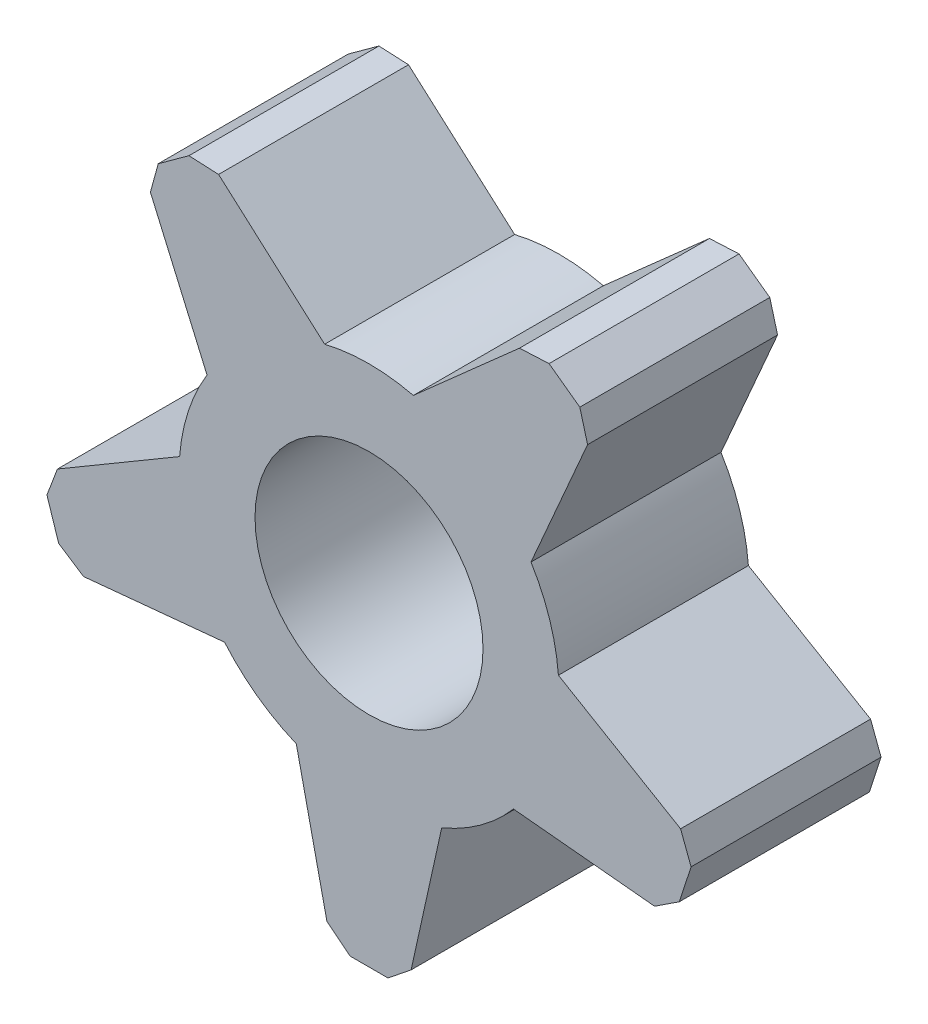
ISO-10303-21;
HEADER;
FILE_DESCRIPTION(('STEP AP214'),'2;1');
FILE_NAME('part.step','',(''),(''),'','','');
FILE_SCHEMA(('AUTOMOTIVE_DESIGN { 1 0 10303 214 1 1 1 1 }'));
ENDSEC;
DATA;
#1=APPLICATION_CONTEXT('core data for automotive mechanical design processes');
#2=APPLICATION_PROTOCOL_DEFINITION('international standard','automotive_design',2000,#1);
#3=PRODUCT_CONTEXT('',#1,'mechanical');
#4=PRODUCT('Part','Part','',(#3));
#5=PRODUCT_RELATED_PRODUCT_CATEGORY('part','',(#4));
#6=PRODUCT_DEFINITION_FORMATION('','',#4);
#7=PRODUCT_DEFINITION_CONTEXT('part definition',#1,'design');
#8=PRODUCT_DEFINITION('design','',#6,#7);
#9=PRODUCT_DEFINITION_SHAPE('','',#8);
#10=(LENGTH_UNIT() NAMED_UNIT(*) SI_UNIT(.MILLI.,.METRE.));
#11=(NAMED_UNIT(*) PLANE_ANGLE_UNIT() SI_UNIT($,.RADIAN.));
#12=(NAMED_UNIT(*) SI_UNIT($,.STERADIAN.) SOLID_ANGLE_UNIT());
#13=UNCERTAINTY_MEASURE_WITH_UNIT(LENGTH_MEASURE(1.E-05),#10,'distance_accuracy_value','');
#14=(GEOMETRIC_REPRESENTATION_CONTEXT(3) GLOBAL_UNCERTAINTY_ASSIGNED_CONTEXT((#13)) GLOBAL_UNIT_ASSIGNED_CONTEXT((#10,
#11,#12)) REPRESENTATION_CONTEXT('',''));
#15=CARTESIAN_POINT('',(0.,0.,0.));
#16=DIRECTION('',(0.,0.,1.));
#17=DIRECTION('',(1.,0.,0.));
#18=AXIS2_PLACEMENT_3D('',#15,#16,#17);
#19=CARTESIAN_POINT('',(0.,0.,-5.));
#20=DIRECTION('',(0.,0.,1.));
#21=DIRECTION('',(1.,0.,0.));
#22=AXIS2_PLACEMENT_3D('',#19,#20,#21);
#23=CYLINDRICAL_SURFACE('',#22,10.);
#24=DIRECTION('',(0.,0.,1.));
#25=VECTOR('',#24,1.);
#26=CARTESIAN_POINT('',(8.52640164354097,5.22498564715941,-5.));
#27=LINE('',#26,#25);
#28=CARTESIAN_POINT('',(8.52640164354097,5.22498564715941,-5.));
#29=VERTEX_POINT('',#28);
#30=CARTESIAN_POINT('',(8.52640164354097,5.22498564715941,5.));
#31=VERTEX_POINT('',#30);
#32=EDGE_CURVE('E39',#29,#31,#27,.T.);
#33=ORIENTED_EDGE('',*,*,#32,.T.);
#34=CARTESIAN_POINT('',(0.,0.,5.));
#35=DIRECTION('',(0.,0.,1.));
#36=DIRECTION('',(1.,0.,0.));
#37=AXIS2_PLACEMENT_3D('',#34,#35,#36);
#38=CIRCLE('',#37,10.);
#39=CARTESIAN_POINT('',(9.96917333733129,0.784590957278344,5.));
#40=VERTEX_POINT('',#39);
#41=EDGE_CURVE('E233',#40,#31,#38,.T.);
#42=ORIENTED_EDGE('',*,*,#41,.F.);
#43=DIRECTION('',(0.,0.,1.));
#44=VECTOR('',#43,1.);
#45=CARTESIAN_POINT('',(9.96917333733129,0.784590957278344,-5.));
#46=LINE('',#45,#44);
#47=CARTESIAN_POINT('',(9.96917333733129,0.784590957278344,-5.));
#48=VERTEX_POINT('',#47);
#49=EDGE_CURVE('E11',#48,#40,#46,.T.);
#50=ORIENTED_EDGE('',*,*,#49,.F.);
#51=CARTESIAN_POINT('',(0.,0.,-5.));
#52=DIRECTION('',(0.,0.,1.));
#53=DIRECTION('',(1.,0.,0.));
#54=AXIS2_PLACEMENT_3D('',#51,#52,#53);
#55=CIRCLE('',#54,10.);
#56=EDGE_CURVE('E236',#48,#29,#55,.T.);
#57=ORIENTED_EDGE('',*,*,#56,.T.);
#58=EDGE_LOOP('',(#33,#42,#50,#57));
#59=FACE_BOUND('',#58,.T.);
#60=ADVANCED_FACE('F35',(#59),#23,.T.);
#61=CARTESIAN_POINT('',(2.90625939543597,4.93988338272082,-5.));
#62=DIRECTION('',(-0.507077891595556,-0.861900233121564,0.));
#63=DIRECTION('',(0.861900233121564,-0.507077891595556,0.));
#64=AXIS2_PLACEMENT_3D('',#61,#62,#63);
#65=PLANE('',#64);
#66=ORIENTED_EDGE('',*,*,#49,.T.);
#67=DIRECTION('',(0.861900233121564,-0.507077891595556,0.));
#68=VECTOR('',#67,1.);
#69=CARTESIAN_POINT('',(2.90625939543597,4.93988338272082,5.));
#70=LINE('',#69,#68);
#71=CARTESIAN_POINT('',(16.3996227907935,-2.99860647737591,5.));
#72=VERTEX_POINT('',#71);
#73=EDGE_CURVE('E253',#40,#72,#70,.T.);
#74=ORIENTED_EDGE('',*,*,#73,.T.);
#75=DIRECTION('',(0.,0.,1.));
#76=VECTOR('',#75,1.);
#77=CARTESIAN_POINT('',(16.3996227907935,-2.99860647737591,-5.));
#78=LINE('',#77,#76);
#79=CARTESIAN_POINT('',(16.3996227907935,-2.99860647737591,-5.));
#80=VERTEX_POINT('',#79);
#81=EDGE_CURVE('E44',#80,#72,#78,.T.);
#82=ORIENTED_EDGE('',*,*,#81,.F.);
#83=DIRECTION('',(0.861900233121564,-0.507077891595556,0.));
#84=VECTOR('',#83,1.);
#85=CARTESIAN_POINT('',(2.90625939543597,4.93988338272082,-5.));
#86=LINE('',#85,#84);
#87=EDGE_CURVE('E241',#48,#80,#86,.T.);
#88=ORIENTED_EDGE('',*,*,#87,.F.);
#89=EDGE_LOOP('',(#66,#74,#82,#88));
#90=FACE_BOUND('',#89,.T.);
#91=ADVANCED_FACE('F522',(#90),#65,.F.);
#92=CARTESIAN_POINT('',(13.3441346827919,5.0597176513826,-5.));
#93=DIRECTION('',(-0.935040521197199,-0.354540863257354,0.));
#94=DIRECTION('',(0.354540863257354,-0.935040521197199,0.));
#95=AXIS2_PLACEMENT_3D('',#92,#93,#94);
#96=PLANE('',#95);
#97=ORIENTED_EDGE('',*,*,#81,.T.);
#98=DIRECTION('',(0.354540863257354,-0.935040521197199,0.));
#99=VECTOR('',#98,1.);
#100=CARTESIAN_POINT('',(13.3441346827919,5.0597176513826,5.));
#101=LINE('',#100,#99);
#102=CARTESIAN_POINT('',(16.9525060295401,-4.45674088526662,5.));
#103=VERTEX_POINT('',#102);
#104=EDGE_CURVE('E326',#72,#103,#101,.T.);
#105=ORIENTED_EDGE('',*,*,#104,.T.);
#106=DIRECTION('',(0.,0.,1.));
#107=VECTOR('',#106,1.);
#108=CARTESIAN_POINT('',(16.9525060295401,-4.45674088526662,-5.));
#109=LINE('',#108,#107);
#110=CARTESIAN_POINT('',(16.9525060295401,-4.45674088526662,-5.));
#111=VERTEX_POINT('',#110);
#112=EDGE_CURVE('E404',#111,#103,#109,.T.);
#113=ORIENTED_EDGE('',*,*,#112,.F.);
#114=DIRECTION('',(0.354540863257354,-0.935040521197199,0.));
#115=VECTOR('',#114,1.);
#116=CARTESIAN_POINT('',(13.3441346827919,5.0597176513826,-5.));
#117=LINE('',#116,#115);
#118=EDGE_CURVE('E58',#80,#111,#117,.T.);
#119=ORIENTED_EDGE('',*,*,#118,.F.);
#120=EDGE_LOOP('',(#97,#105,#113,#119));
#121=FACE_BOUND('',#120,.T.);
#122=ADVANCED_FACE('F519',(#121),#96,.F.);
#123=CARTESIAN_POINT('',(16.6434890351651,-5.40779740156182,-5.));
#124=DIRECTION('',(-0.951056516295149,0.309016994374961,0.));
#125=DIRECTION('',(-0.309016994374961,-0.951056516295149,0.));
#126=AXIS2_PLACEMENT_3D('',#123,#124,#125);
#127=PLANE('',#126);
#128=ORIENTED_EDGE('',*,*,#112,.T.);
#129=DIRECTION('',(-0.309016994374961,-0.951056516295149,0.));
#130=VECTOR('',#129,1.);
#131=CARTESIAN_POINT('',(16.6434890351651,-5.40779740156182,5.));
#132=LINE('',#131,#130);
#133=CARTESIAN_POINT('',(16.3344720407902,-6.35885391785692,5.));
#134=VERTEX_POINT('',#133);
#135=EDGE_CURVE('E323',#103,#134,#132,.T.);
#136=ORIENTED_EDGE('',*,*,#135,.T.);
#137=DIRECTION('',(0.,0.,1.));
#138=VECTOR('',#137,1.);
#139=CARTESIAN_POINT('',(16.3344720407902,-6.35885391785692,-5.));
#140=LINE('',#139,#138);
#141=CARTESIAN_POINT('',(16.3344720407902,-6.35885391785692,-5.));
#142=VERTEX_POINT('',#141);
#143=EDGE_CURVE('E406',#142,#134,#140,.T.);
#144=ORIENTED_EDGE('',*,*,#143,.F.);
#145=DIRECTION('',(-0.309016994374961,-0.951056516295149,0.));
#146=VECTOR('',#145,1.);
#147=CARTESIAN_POINT('',(16.6434890351651,-5.40779740156182,-5.));
#148=LINE('',#147,#146);
#149=EDGE_CURVE('E399',#111,#142,#148,.T.);
#150=ORIENTED_EDGE('',*,*,#149,.F.);
#151=EDGE_LOOP('',(#128,#136,#144,#150));
#152=FACE_BOUND('',#151,.T.);
#153=ADVANCED_FACE('F518',(#152),#127,.F.);
#154=CARTESIAN_POINT('',(7.82160431735998,-11.9368831378572,-5.));
#155=DIRECTION('',(0.54806978132001,-0.836432612231157,0.));
#156=DIRECTION('',(0.836432612231157,0.54806978132001,0.));
#157=AXIS2_PLACEMENT_3D('',#154,#155,#156);
#158=PLANE('',#157);
#159=ORIENTED_EDGE('',*,*,#143,.T.);
#160=DIRECTION('',(0.836432612231157,0.54806978132001,0.));
#161=VECTOR('',#160,1.);
#162=CARTESIAN_POINT('',(7.82160431735998,-11.9368831378572,5.));
#163=LINE('',#162,#161);
#164=CARTESIAN_POINT('',(15.0301102039207,-7.21353281994837,5.));
#165=VERTEX_POINT('',#164);
#166=EDGE_CURVE('E320',#165,#134,#163,.T.);
#167=ORIENTED_EDGE('',*,*,#166,.F.);
#168=DIRECTION('',(0.,0.,1.));
#169=VECTOR('',#168,1.);
#170=CARTESIAN_POINT('',(15.0301102039207,-7.21353281994837,-5.));
#171=LINE('',#170,#169);
#172=CARTESIAN_POINT('',(15.0301102039207,-7.21353281994837,-5.));
#173=VERTEX_POINT('',#172);
#174=EDGE_CURVE('E408',#173,#165,#171,.T.);
#175=ORIENTED_EDGE('',*,*,#174,.F.);
#176=DIRECTION('',(0.836432612231157,0.54806978132001,0.));
#177=VECTOR('',#176,1.);
#178=CARTESIAN_POINT('',(7.82160431735998,-11.9368831378572,-5.));
#179=LINE('',#178,#177);
#180=EDGE_CURVE('E396',#173,#142,#179,.T.);
#181=ORIENTED_EDGE('',*,*,#180,.T.);
#182=EDGE_LOOP('',(#159,#167,#175,#181));
#183=FACE_BOUND('',#182,.T.);
#184=ADVANCED_FACE('F515',(#183),#158,.T.);
#185=CARTESIAN_POINT('',(-0.552377359438521,-5.70470601882524,-5.));
#186=DIRECTION('',(-0.0963776142036998,-0.995344842494501,0.));
#187=DIRECTION('',(0.995344842494501,-0.0963776142036998,0.));
#188=AXIS2_PLACEMENT_3D('',#185,#186,#187);
#189=PLANE('',#188);
#190=ORIENTED_EDGE('',*,*,#174,.T.);
#191=DIRECTION('',(0.995344842494501,-0.0963776142036998,0.));
#192=VECTOR('',#191,1.);
#193=CARTESIAN_POINT('',(-0.552377359438521,-5.70470601882524,5.));
#194=LINE('',#193,#192);
#195=CARTESIAN_POINT('',(7.60405965600023,-6.49448048330193,5.));
#196=VERTEX_POINT('',#195);
#197=EDGE_CURVE('E261',#196,#165,#194,.T.);
#198=ORIENTED_EDGE('',*,*,#197,.F.);
#199=DIRECTION('',(0.,0.,1.));
#200=VECTOR('',#199,1.);
#201=CARTESIAN_POINT('',(7.60405965600023,-6.49448048330193,-5.));
#202=LINE('',#201,#200);
#203=CARTESIAN_POINT('',(7.60405965600023,-6.49448048330193,-5.));
#204=VERTEX_POINT('',#203);
#205=EDGE_CURVE('E410',#204,#196,#202,.T.);
#206=ORIENTED_EDGE('',*,*,#205,.F.);
#207=DIRECTION('',(0.995344842494501,-0.0963776142036998,0.));
#208=VECTOR('',#207,1.);
#209=CARTESIAN_POINT('',(-0.552377359438521,-5.70470601882524,-5.));
#210=LINE('',#209,#208);
#211=EDGE_CURVE('E393',#204,#173,#210,.T.);
#212=ORIENTED_EDGE('',*,*,#211,.T.);
#213=EDGE_LOOP('',(#190,#198,#206,#212));
#214=FACE_BOUND('',#213,.T.);
#215=ADVANCED_FACE('F509',(#214),#189,.T.);
#216=ORIENTED_EDGE('',*,*,#205,.T.);
#217=CARTESIAN_POINT('',(3.82683432365091,-9.23879532511286,5.));
#218=VERTEX_POINT('',#217);
#219=EDGE_CURVE('E256',#218,#196,#38,.T.);
#220=ORIENTED_EDGE('',*,*,#219,.F.);
#221=DIRECTION('',(0.,0.,1.));
#222=VECTOR('',#221,1.);
#223=CARTESIAN_POINT('',(3.82683432365091,-9.23879532511286,-5.));
#224=LINE('',#223,#222);
#225=CARTESIAN_POINT('',(3.82683432365091,-9.23879532511286,-5.));
#226=VERTEX_POINT('',#225);
#227=EDGE_CURVE('E412',#226,#218,#224,.T.);
#228=ORIENTED_EDGE('',*,*,#227,.F.);
#229=EDGE_CURVE('E335',#226,#204,#55,.T.);
#230=ORIENTED_EDGE('',*,*,#229,.T.);
#231=EDGE_LOOP('',(#216,#220,#228,#230));
#232=FACE_BOUND('',#231,.T.);
#233=ADVANCED_FACE('F502',(#232),#23,.T.);
#234=CARTESIAN_POINT('',(5.59619182412638,-1.2375090205822,-5.));
#235=DIRECTION('',(-0.976411519081421,0.215917913580859,0.));
#236=DIRECTION('',(-0.215917913580859,-0.976411519081421,0.));
#237=AXIS2_PLACEMENT_3D('',#234,#235,#236);
#238=PLANE('',#237);
#239=ORIENTED_EDGE('',*,*,#227,.T.);
#240=DIRECTION('',(-0.215917913580859,-0.976411519081421,0.));
#241=VECTOR('',#240,1.);
#242=CARTESIAN_POINT('',(5.59619182412638,-1.2375090205822,5.));
#243=LINE('',#242,#241);
#244=CARTESIAN_POINT('',(2.21591791358085,-16.5235884809186,5.));
#245=VERTEX_POINT('',#244);
#246=EDGE_CURVE('E262',#218,#245,#243,.T.);
#247=ORIENTED_EDGE('',*,*,#246,.T.);
#248=DIRECTION('',(0.,0.,1.));
#249=VECTOR('',#248,1.);
#250=CARTESIAN_POINT('',(2.21591791358085,-16.5235884809186,-5.));
#251=LINE('',#250,#249);
#252=CARTESIAN_POINT('',(2.21591791358085,-16.5235884809186,-5.));
#253=VERTEX_POINT('',#252);
#254=EDGE_CURVE('E414',#253,#245,#251,.T.);
#255=ORIENTED_EDGE('',*,*,#254,.F.);
#256=DIRECTION('',(-0.215917913580859,-0.976411519081421,0.));
#257=VECTOR('',#256,1.);
#258=CARTESIAN_POINT('',(5.59619182412638,-1.2375090205822,-5.));
#259=LINE('',#258,#257);
#260=EDGE_CURVE('E390',#226,#253,#259,.T.);
#261=ORIENTED_EDGE('',*,*,#260,.F.);
#262=EDGE_LOOP('',(#239,#247,#255,#261));
#263=FACE_BOUND('',#262,.T.);
#264=ADVANCED_FACE('F579',(#263),#238,.F.);
#265=CARTESIAN_POINT('',(8.93564183517203,-11.1274875033732,-5.));
#266=DIRECTION('',(-0.62613180977297,0.779717228737717,0.));
#267=DIRECTION('',(-0.779717228737717,-0.62613180977297,0.));
#268=AXIS2_PLACEMENT_3D('',#265,#266,#267);
#269=PLANE('',#268);
#270=ORIENTED_EDGE('',*,*,#254,.T.);
#271=DIRECTION('',(-0.779717228737717,-0.62613180977297,0.));
#272=VECTOR('',#271,1.);
#273=CARTESIAN_POINT('',(8.93564183517203,-11.1274875033732,5.));
#274=LINE('',#273,#272);
#275=CARTESIAN_POINT('',(1.,-17.5,5.));
#276=VERTEX_POINT('',#275);
#277=EDGE_CURVE('E313',#245,#276,#274,.T.);
#278=ORIENTED_EDGE('',*,*,#277,.T.);
#279=DIRECTION('',(0.,0.,1.));
#280=VECTOR('',#279,1.);
#281=CARTESIAN_POINT('',(1.,-17.5,-5.));
#282=LINE('',#281,#280);
#283=CARTESIAN_POINT('',(1.,-17.5,-5.));
#284=VERTEX_POINT('',#283);
#285=EDGE_CURVE('E416',#284,#276,#282,.T.);
#286=ORIENTED_EDGE('',*,*,#285,.F.);
#287=DIRECTION('',(-0.779717228737717,-0.62613180977297,0.));
#288=VECTOR('',#287,1.);
#289=CARTESIAN_POINT('',(8.93564183517203,-11.1274875033732,-5.));
#290=LINE('',#289,#288);
#291=EDGE_CURVE('E387',#253,#284,#290,.T.);
#292=ORIENTED_EDGE('',*,*,#291,.F.);
#293=EDGE_LOOP('',(#270,#278,#286,#292));
#294=FACE_BOUND('',#293,.T.);
#295=ADVANCED_FACE('F585',(#294),#269,.F.);
#296=CARTESIAN_POINT('',(0.,-17.5,-5.));
#297=DIRECTION('',(0.,1.,0.));
#298=DIRECTION('',(-1.,0.,0.));
#299=AXIS2_PLACEMENT_3D('',#296,#297,#298);
#300=PLANE('',#299);
#301=ORIENTED_EDGE('',*,*,#285,.T.);
#302=DIRECTION('',(-1.,0.,0.));
#303=VECTOR('',#302,1.);
#304=CARTESIAN_POINT('',(0.,-17.5,5.));
#305=LINE('',#304,#303);
#306=CARTESIAN_POINT('',(-0.999999999999999,-17.5,5.));
#307=VERTEX_POINT('',#306);
#308=EDGE_CURVE('E310',#276,#307,#305,.T.);
#309=ORIENTED_EDGE('',*,*,#308,.T.);
#310=DIRECTION('',(0.,0.,1.));
#311=VECTOR('',#310,1.);
#312=CARTESIAN_POINT('',(-0.999999999999999,-17.5,-5.));
#313=LINE('',#312,#311);
#314=CARTESIAN_POINT('',(-0.999999999999999,-17.5,-5.));
#315=VERTEX_POINT('',#314);
#316=EDGE_CURVE('E418',#315,#307,#313,.T.);
#317=ORIENTED_EDGE('',*,*,#316,.F.);
#318=DIRECTION('',(-1.,0.,0.));
#319=VECTOR('',#318,1.);
#320=CARTESIAN_POINT('',(0.,-17.5,-5.));
#321=LINE('',#320,#319);
#322=EDGE_CURVE('E385',#284,#315,#321,.T.);
#323=ORIENTED_EDGE('',*,*,#322,.F.);
#324=EDGE_LOOP('',(#301,#309,#317,#323));
#325=FACE_BOUND('',#324,.T.);
#326=ADVANCED_FACE('F673',(#325),#300,.F.);
#327=CARTESIAN_POINT('',(-8.935641835172,-11.1274875033732,-5.));
#328=DIRECTION('',(-0.626131809772967,-0.77971722873772,0.));
#329=DIRECTION('',(0.77971722873772,-0.626131809772967,0.));
#330=AXIS2_PLACEMENT_3D('',#327,#328,#329);
#331=PLANE('',#330);
#332=ORIENTED_EDGE('',*,*,#316,.T.);
#333=DIRECTION('',(0.77971722873772,-0.626131809772967,0.));
#334=VECTOR('',#333,1.);
#335=CARTESIAN_POINT('',(-8.935641835172,-11.1274875033732,5.));
#336=LINE('',#335,#334);
#337=CARTESIAN_POINT('',(-2.21591791358086,-16.5235884809186,5.));
#338=VERTEX_POINT('',#337);
#339=EDGE_CURVE('E296',#338,#307,#336,.T.);
#340=ORIENTED_EDGE('',*,*,#339,.F.);
#341=DIRECTION('',(0.,0.,1.));
#342=VECTOR('',#341,1.);
#343=CARTESIAN_POINT('',(-2.21591791358086,-16.5235884809186,-5.));
#344=LINE('',#343,#342);
#345=CARTESIAN_POINT('',(-2.21591791358086,-16.5235884809186,-5.));
#346=VERTEX_POINT('',#345);
#347=EDGE_CURVE('E420',#346,#338,#344,.T.);
#348=ORIENTED_EDGE('',*,*,#347,.F.);
#349=DIRECTION('',(0.77971722873772,-0.626131809772967,0.));
#350=VECTOR('',#349,1.);
#351=CARTESIAN_POINT('',(-8.935641835172,-11.1274875033732,-5.));
#352=LINE('',#351,#350);
#353=EDGE_CURVE('E382',#346,#315,#352,.T.);
#354=ORIENTED_EDGE('',*,*,#353,.T.);
#355=EDGE_LOOP('',(#332,#340,#348,#354));
#356=FACE_BOUND('',#355,.T.);
#357=ADVANCED_FACE('F594',(#356),#331,.T.);
#358=CARTESIAN_POINT('',(-5.59619182412637,-1.23750902058219,-5.));
#359=DIRECTION('',(-0.976411519081422,-0.215917913580858,0.));
#360=DIRECTION('',(0.215917913580858,-0.976411519081422,0.));
#361=AXIS2_PLACEMENT_3D('',#358,#359,#360);
#362=PLANE('',#361);
#363=ORIENTED_EDGE('',*,*,#347,.T.);
#364=DIRECTION('',(0.215917913580858,-0.976411519081421,0.));
#365=VECTOR('',#364,1.);
#366=CARTESIAN_POINT('',(-5.59619182412637,-1.23750902058219,5.));
#367=LINE('',#366,#365);
#368=CARTESIAN_POINT('',(-3.8268343236509,-9.23879532511286,5.));
#369=VERTEX_POINT('',#368);
#370=EDGE_CURVE('E290',#369,#338,#367,.T.);
#371=ORIENTED_EDGE('',*,*,#370,.F.);
#372=DIRECTION('',(0.,0.,1.));
#373=VECTOR('',#372,1.);
#374=CARTESIAN_POINT('',(-3.8268343236509,-9.23879532511286,-5.));
#375=LINE('',#374,#373);
#376=CARTESIAN_POINT('',(-3.8268343236509,-9.23879532511286,-5.));
#377=VERTEX_POINT('',#376);
#378=EDGE_CURVE('E422',#377,#369,#375,.T.);
#379=ORIENTED_EDGE('',*,*,#378,.F.);
#380=DIRECTION('',(0.215917913580858,-0.976411519081421,0.));
#381=VECTOR('',#380,1.);
#382=CARTESIAN_POINT('',(-5.59619182412637,-1.23750902058219,-5.));
#383=LINE('',#382,#381);
#384=EDGE_CURVE('E379',#377,#346,#383,.T.);
#385=ORIENTED_EDGE('',*,*,#384,.T.);
#386=EDGE_LOOP('',(#363,#371,#379,#385));
#387=FACE_BOUND('',#386,.T.);
#388=ADVANCED_FACE('F588',(#387),#362,.T.);
#389=ORIENTED_EDGE('',*,*,#378,.T.);
#390=CARTESIAN_POINT('',(-7.60405965600032,-6.49448048330182,5.));
#391=VERTEX_POINT('',#390);
#392=EDGE_CURVE('E263',#391,#369,#38,.T.);
#393=ORIENTED_EDGE('',*,*,#392,.F.);
#394=DIRECTION('',(0.,0.,1.));
#395=VECTOR('',#394,1.);
#396=CARTESIAN_POINT('',(-7.60405965600032,-6.49448048330182,-5.));
#397=LINE('',#396,#395);
#398=CARTESIAN_POINT('',(-7.60405965600032,-6.49448048330182,-5.));
#399=VERTEX_POINT('',#398);
#400=EDGE_CURVE('E424',#399,#391,#397,.T.);
#401=ORIENTED_EDGE('',*,*,#400,.F.);
#402=EDGE_CURVE('E378',#399,#377,#55,.T.);
#403=ORIENTED_EDGE('',*,*,#402,.T.);
#404=EDGE_LOOP('',(#389,#393,#401,#403));
#405=FACE_BOUND('',#404,.T.);
#406=ADVANCED_FACE('F580',(#405),#23,.T.);
#407=CARTESIAN_POINT('',(0.552377359438441,-5.70470601882524,-5.));
#408=DIRECTION('',(-0.0963776142036859,0.995344842494502,0.));
#409=DIRECTION('',(-0.995344842494502,-0.0963776142036859,0.));
#410=AXIS2_PLACEMENT_3D('',#407,#408,#409);
#411=PLANE('',#410);
#412=ORIENTED_EDGE('',*,*,#400,.T.);
#413=DIRECTION('',(-0.995344842494502,-0.0963776142036859,0.));
#414=VECTOR('',#413,1.);
#415=CARTESIAN_POINT('',(0.552377359438441,-5.70470601882524,5.));
#416=LINE('',#415,#414);
#417=CARTESIAN_POINT('',(-15.0301102039208,-7.21353281994816,5.));
#418=VERTEX_POINT('',#417);
#419=EDGE_CURVE('E291',#391,#418,#416,.T.);
#420=ORIENTED_EDGE('',*,*,#419,.T.);
#421=DIRECTION('',(0.,0.,1.));
#422=VECTOR('',#421,1.);
#423=CARTESIAN_POINT('',(-15.0301102039208,-7.21353281994816,-5.));
#424=LINE('',#423,#422);
#425=CARTESIAN_POINT('',(-15.0301102039208,-7.21353281994816,-5.));
#426=VERTEX_POINT('',#425);
#427=EDGE_CURVE('E426',#426,#418,#424,.T.);
#428=ORIENTED_EDGE('',*,*,#427,.F.);
#429=DIRECTION('',(-0.995344842494502,-0.0963776142036859,0.));
#430=VECTOR('',#429,1.);
#431=CARTESIAN_POINT('',(0.552377359438441,-5.70470601882524,-5.));
#432=LINE('',#431,#430);
#433=EDGE_CURVE('E375',#399,#426,#432,.T.);
#434=ORIENTED_EDGE('',*,*,#433,.F.);
#435=EDGE_LOOP('',(#412,#420,#428,#434));
#436=FACE_BOUND('',#435,.T.);
#437=ADVANCED_FACE('F490',(#436),#411,.F.);
#438=CARTESIAN_POINT('',(-7.82160431736016,-11.9368831378571,-5.));
#439=DIRECTION('',(0.548069781320022,0.836432612231149,0.));
#440=DIRECTION('',(-0.836432612231149,0.548069781320022,0.));
#441=AXIS2_PLACEMENT_3D('',#438,#439,#440);
#442=PLANE('',#441);
#443=ORIENTED_EDGE('',*,*,#427,.T.);
#444=DIRECTION('',(-0.836432612231149,0.548069781320022,0.));
#445=VECTOR('',#444,1.);
#446=CARTESIAN_POINT('',(-7.82160431736016,-11.9368831378571,5.));
#447=LINE('',#446,#445);
#448=CARTESIAN_POINT('',(-16.3344720407903,-6.35885391785669,5.));
#449=VERTEX_POINT('',#448);
#450=EDGE_CURVE('E299',#418,#449,#447,.T.);
#451=ORIENTED_EDGE('',*,*,#450,.T.);
#452=DIRECTION('',(0.,0.,1.));
#453=VECTOR('',#452,1.);
#454=CARTESIAN_POINT('',(-16.3344720407903,-6.35885391785669,-5.));
#455=LINE('',#454,#453);
#456=CARTESIAN_POINT('',(-16.3344720407903,-6.35885391785669,-5.));
#457=VERTEX_POINT('',#456);
#458=EDGE_CURVE('E428',#457,#449,#455,.T.);
#459=ORIENTED_EDGE('',*,*,#458,.F.);
#460=DIRECTION('',(-0.836432612231149,0.548069781320022,0.));
#461=VECTOR('',#460,1.);
#462=CARTESIAN_POINT('',(-7.82160431736016,-11.9368831378571,-5.));
#463=LINE('',#462,#461);
#464=EDGE_CURVE('E372',#426,#457,#463,.T.);
#465=ORIENTED_EDGE('',*,*,#464,.F.);
#466=EDGE_LOOP('',(#443,#451,#459,#465));
#467=FACE_BOUND('',#466,.T.);
#468=ADVANCED_FACE('F488',(#467),#442,.F.);
#469=CARTESIAN_POINT('',(-16.6434890351652,-5.40779740156152,-5.));
#470=DIRECTION('',(0.951056516295155,0.309016994374944,0.));
#471=DIRECTION('',(-0.309016994374944,0.951056516295155,0.));
#472=AXIS2_PLACEMENT_3D('',#469,#470,#471);
#473=PLANE('',#472);
#474=ORIENTED_EDGE('',*,*,#458,.T.);
#475=DIRECTION('',(-0.309016994374944,0.951056516295155,0.));
#476=VECTOR('',#475,1.);
#477=CARTESIAN_POINT('',(-16.6434890351652,-5.40779740156152,5.));
#478=LINE('',#477,#476);
#479=CARTESIAN_POINT('',(-16.9525060295402,-4.45674088526638,5.));
#480=VERTEX_POINT('',#479);
#481=EDGE_CURVE('E304',#449,#480,#478,.T.);
#482=ORIENTED_EDGE('',*,*,#481,.T.);
#483=DIRECTION('',(0.,0.,1.));
#484=VECTOR('',#483,1.);
#485=CARTESIAN_POINT('',(-16.9525060295402,-4.45674088526638,-5.));
#486=LINE('',#485,#484);
#487=CARTESIAN_POINT('',(-16.9525060295402,-4.45674088526638,-5.));
#488=VERTEX_POINT('',#487);
#489=EDGE_CURVE('E430',#488,#480,#486,.T.);
#490=ORIENTED_EDGE('',*,*,#489,.F.);
#491=DIRECTION('',(-0.309016994374944,0.951056516295155,0.));
#492=VECTOR('',#491,1.);
#493=CARTESIAN_POINT('',(-16.6434890351652,-5.40779740156152,-5.));
#494=LINE('',#493,#492);
#495=EDGE_CURVE('E370',#457,#488,#494,.T.);
#496=ORIENTED_EDGE('',*,*,#495,.F.);
#497=EDGE_LOOP('',(#474,#482,#490,#496));
#498=FACE_BOUND('',#497,.T.);
#499=ADVANCED_FACE('F483',(#498),#473,.F.);
#500=CARTESIAN_POINT('',(-13.3441346827919,5.05971765138277,-5.));
#501=DIRECTION('',(-0.935040521197195,0.354540863257366,0.));
#502=DIRECTION('',(-0.354540863257366,-0.935040521197195,0.));
#503=AXIS2_PLACEMENT_3D('',#500,#501,#502);
#504=PLANE('',#503);
#505=ORIENTED_EDGE('',*,*,#489,.T.);
#506=DIRECTION('',(-0.354540863257366,-0.935040521197195,0.));
#507=VECTOR('',#506,1.);
#508=CARTESIAN_POINT('',(-13.3441346827919,5.05971765138277,5.));
#509=LINE('',#508,#507);
#510=CARTESIAN_POINT('',(-16.3996227907935,-2.99860647737568,5.));
#511=VERTEX_POINT('',#510);
#512=EDGE_CURVE('E284',#511,#480,#509,.T.);
#513=ORIENTED_EDGE('',*,*,#512,.F.);
#514=DIRECTION('',(0.,0.,1.));
#515=VECTOR('',#514,1.);
#516=CARTESIAN_POINT('',(-16.3996227907935,-2.99860647737568,-5.));
#517=LINE('',#516,#515);
#518=CARTESIAN_POINT('',(-16.3996227907935,-2.99860647737568,-5.));
#519=VERTEX_POINT('',#518);
#520=EDGE_CURVE('E432',#519,#511,#517,.T.);
#521=ORIENTED_EDGE('',*,*,#520,.F.);
#522=DIRECTION('',(-0.354540863257366,-0.935040521197195,0.));
#523=VECTOR('',#522,1.);
#524=CARTESIAN_POINT('',(-13.3441346827919,5.05971765138277,-5.));
#525=LINE('',#524,#523);
#526=EDGE_CURVE('E367',#519,#488,#525,.T.);
#527=ORIENTED_EDGE('',*,*,#526,.T.);
#528=EDGE_LOOP('',(#505,#513,#521,#527));
#529=FACE_BOUND('',#528,.T.);
#530=ADVANCED_FACE('F560',(#529),#504,.T.);
#531=CARTESIAN_POINT('',(-2.9062593954359,4.93988338272086,-5.));
#532=DIRECTION('',(-0.507077891595544,0.861900233121571,0.));
#533=DIRECTION('',(-0.861900233121571,-0.507077891595544,0.));
#534=AXIS2_PLACEMENT_3D('',#531,#532,#533);
#535=PLANE('',#534);
#536=ORIENTED_EDGE('',*,*,#520,.T.);
#537=DIRECTION('',(-0.861900233121571,-0.507077891595544,0.));
#538=VECTOR('',#537,1.);
#539=CARTESIAN_POINT('',(-2.9062593954359,4.93988338272086,5.));
#540=LINE('',#539,#538);
#541=CARTESIAN_POINT('',(-9.96917333733128,0.784590957278485,5.));
#542=VERTEX_POINT('',#541);
#543=EDGE_CURVE('E278',#542,#511,#540,.T.);
#544=ORIENTED_EDGE('',*,*,#543,.F.);
#545=DIRECTION('',(0.,0.,1.));
#546=VECTOR('',#545,1.);
#547=CARTESIAN_POINT('',(-9.96917333733128,0.784590957278485,-5.));
#548=LINE('',#547,#546);
#549=CARTESIAN_POINT('',(-9.96917333733128,0.784590957278485,-5.));
#550=VERTEX_POINT('',#549);
#551=EDGE_CURVE('E434',#550,#542,#548,.T.);
#552=ORIENTED_EDGE('',*,*,#551,.F.);
#553=DIRECTION('',(-0.861900233121571,-0.507077891595544,0.));
#554=VECTOR('',#553,1.);
#555=CARTESIAN_POINT('',(-2.9062593954359,4.93988338272086,-5.));
#556=LINE('',#555,#554);
#557=EDGE_CURVE('E364',#550,#519,#556,.T.);
#558=ORIENTED_EDGE('',*,*,#557,.T.);
#559=EDGE_LOOP('',(#536,#544,#552,#558));
#560=FACE_BOUND('',#559,.T.);
#561=ADVANCED_FACE('F557',(#560),#535,.T.);
#562=ORIENTED_EDGE('',*,*,#551,.T.);
#563=CARTESIAN_POINT('',(-8.5264016435409,5.22498564715953,5.));
#564=VERTEX_POINT('',#563);
#565=EDGE_CURVE('E267',#564,#542,#38,.T.);
#566=ORIENTED_EDGE('',*,*,#565,.F.);
#567=DIRECTION('',(0.,0.,1.));
#568=VECTOR('',#567,1.);
#569=CARTESIAN_POINT('',(-8.5264016435409,5.22498564715953,-5.));
#570=LINE('',#569,#568);
#571=CARTESIAN_POINT('',(-8.5264016435409,5.22498564715953,-5.));
#572=VERTEX_POINT('',#571);
#573=EDGE_CURVE('E436',#572,#564,#570,.T.);
#574=ORIENTED_EDGE('',*,*,#573,.F.);
#575=EDGE_CURVE('E363',#572,#550,#55,.T.);
#576=ORIENTED_EDGE('',*,*,#575,.T.);
#577=EDGE_LOOP('',(#562,#566,#574,#576));
#578=FACE_BOUND('',#577,.T.);
#579=ADVANCED_FACE('F554',(#578),#23,.T.);
#580=CARTESIAN_POINT('',(-5.2548038413775,-2.28819319487787,-5.));
#581=DIRECTION('',(0.916846877748919,0.39923902960765,0.));
#582=DIRECTION('',(-0.39923902960765,0.916846877748919,0.));
#583=AXIS2_PLACEMENT_3D('',#580,#581,#582);
#584=PLANE('',#583);
#585=ORIENTED_EDGE('',*,*,#573,.T.);
#586=DIRECTION('',(-0.39923902960765,0.916846877748919,0.));
#587=VECTOR('',#586,1.);
#588=CARTESIAN_POINT('',(-5.2548038413775,-2.28819319487787,5.));
#589=LINE('',#588,#587);
#590=CARTESIAN_POINT('',(-11.5050368742605,12.0653800192278,5.));
#591=VERTEX_POINT('',#590);
#592=EDGE_CURVE('E279',#564,#591,#589,.T.);
#593=ORIENTED_EDGE('',*,*,#592,.T.);
#594=DIRECTION('',(0.,0.,1.));
#595=VECTOR('',#594,1.);
#596=CARTESIAN_POINT('',(-11.5050368742605,12.0653800192278,-5.));
#597=LINE('',#596,#595);
#598=CARTESIAN_POINT('',(-11.5050368742605,12.0653800192278,-5.));
#599=VERTEX_POINT('',#598);
#600=EDGE_CURVE('E438',#599,#591,#597,.T.);
#601=ORIENTED_EDGE('',*,*,#600,.F.);
#602=DIRECTION('',(-0.39923902960765,0.916846877748919,0.));
#603=VECTOR('',#602,1.);
#604=CARTESIAN_POINT('',(-5.2548038413775,-2.28819319487787,-5.));
#605=LINE('',#604,#603);
#606=EDGE_CURVE('E360',#572,#599,#605,.T.);
#607=ORIENTED_EDGE('',*,*,#606,.F.);
#608=EDGE_LOOP('',(#585,#593,#601,#607));
#609=FACE_BOUND('',#608,.T.);
#610=ADVANCED_FACE('F550',(#609),#584,.F.);
#611=CARTESIAN_POINT('',(-13.7696591498535,3.75008800444211,-5.));
#612=DIRECTION('',(0.964857562835459,-0.262773445080012,0.));
#613=DIRECTION('',(0.262773445080012,0.964857562835459,0.));
#614=AXIS2_PLACEMENT_3D('',#611,#612,#613);
#615=PLANE('',#614);
#616=ORIENTED_EDGE('',*,*,#600,.T.);
#617=DIRECTION('',(0.262773445080012,0.964857562835459,0.));
#618=VECTOR('',#617,1.);
#619=CARTESIAN_POINT('',(-13.7696591498535,3.75008800444211,5.));
#620=LINE('',#619,#618);
#621=CARTESIAN_POINT('',(-11.0952589094932,13.5700121492692,5.));
#622=VERTEX_POINT('',#621);
#623=EDGE_CURVE('E287',#591,#622,#620,.T.);
#624=ORIENTED_EDGE('',*,*,#623,.T.);
#625=DIRECTION('',(0.,0.,1.));
#626=VECTOR('',#625,1.);
#627=CARTESIAN_POINT('',(-11.0952589094932,13.5700121492692,-5.));
#628=LINE('',#627,#626);
#629=CARTESIAN_POINT('',(-11.0952589094932,13.5700121492692,-5.));
#630=VERTEX_POINT('',#629);
#631=EDGE_CURVE('E440',#630,#622,#628,.T.);
#632=ORIENTED_EDGE('',*,*,#631,.F.);
#633=DIRECTION('',(0.262773445080012,0.964857562835459,0.));
#634=VECTOR('',#633,1.);
#635=CARTESIAN_POINT('',(-13.7696591498535,3.75008800444211,-5.));
#636=LINE('',#635,#634);
#637=EDGE_CURVE('E357',#599,#630,#636,.T.);
#638=ORIENTED_EDGE('',*,*,#637,.F.);
#639=EDGE_LOOP('',(#616,#624,#632,#638));
#640=FACE_BOUND('',#639,.T.);
#641=ADVANCED_FACE('F547',(#640),#615,.F.);
#642=CARTESIAN_POINT('',(-10.2862419151182,14.1577974015617,-5.));
#643=DIRECTION('',(0.587785252292467,-0.809016994374952,0.));
#644=DIRECTION('',(0.809016994374952,0.587785252292467,0.));
#645=AXIS2_PLACEMENT_3D('',#642,#643,#644);
#646=PLANE('',#645);
#647=ORIENTED_EDGE('',*,*,#631,.T.);
#648=DIRECTION('',(0.809016994374952,0.587785252292467,0.));
#649=VECTOR('',#648,1.);
#650=CARTESIAN_POINT('',(-10.2862419151182,14.1577974015617,5.));
#651=LINE('',#650,#649);
#652=CARTESIAN_POINT('',(-9.47722492074325,14.7455826538541,5.));
#653=VERTEX_POINT('',#652);
#654=EDGE_CURVE('E473',#622,#653,#651,.T.);
#655=ORIENTED_EDGE('',*,*,#654,.T.);
#656=DIRECTION('',(0.,0.,1.));
#657=VECTOR('',#656,1.);
#658=CARTESIAN_POINT('',(-9.47722492074325,14.7455826538541,-5.));
#659=LINE('',#658,#657);
#660=CARTESIAN_POINT('',(-9.47722492074325,14.7455826538541,-5.));
#661=VERTEX_POINT('',#660);
#662=EDGE_CURVE('E442',#661,#653,#659,.T.);
#663=ORIENTED_EDGE('',*,*,#662,.F.);
#664=DIRECTION('',(0.809016994374952,0.587785252292467,0.));
#665=VECTOR('',#664,1.);
#666=CARTESIAN_POINT('',(-10.2862419151182,14.1577974015617,-5.));
#667=LINE('',#666,#665);
#668=EDGE_CURVE('E355',#630,#661,#667,.T.);
#669=ORIENTED_EDGE('',*,*,#668,.F.);
#670=EDGE_LOOP('',(#647,#655,#663,#669));
#671=FACE_BOUND('',#670,.T.);
#672=ADVANCED_FACE('F544',(#671),#646,.F.);
#673=CARTESIAN_POINT('',(0.688513050750389,14.2545649854056,-5.));
#674=DIRECTION('',(0.0482449868146879,0.998835532631499,0.));
#675=DIRECTION('',(-0.998835532631499,0.0482449868146879,0.));
#676=AXIS2_PLACEMENT_3D('',#673,#674,#675);
#677=PLANE('',#676);
#678=ORIENTED_EDGE('',*,*,#662,.T.);
#679=DIRECTION('',(-0.998835532631499,0.0482449868146879,0.));
#680=VECTOR('',#679,1.);
#681=CARTESIAN_POINT('',(0.688513050750389,14.2545649854056,5.));
#682=LINE('',#681,#680);
#683=CARTESIAN_POINT('',(-7.91960637380686,14.6703477590148,5.));
#684=VERTEX_POINT('',#683);
#685=EDGE_CURVE('E272',#684,#653,#682,.T.);
#686=ORIENTED_EDGE('',*,*,#685,.F.);
#687=DIRECTION('',(0.,0.,1.));
#688=VECTOR('',#687,1.);
#689=CARTESIAN_POINT('',(-7.91960637380686,14.6703477590148,-5.));
#690=LINE('',#689,#688);
#691=CARTESIAN_POINT('',(-7.91960637380686,14.6703477590148,-5.));
#692=VERTEX_POINT('',#691);
#693=EDGE_CURVE('E444',#692,#684,#690,.T.);
#694=ORIENTED_EDGE('',*,*,#693,.F.);
#695=DIRECTION('',(-0.998835532631499,0.0482449868146879,0.));
#696=VECTOR('',#695,1.);
#697=CARTESIAN_POINT('',(0.688513050750389,14.2545649854056,-5.));
#698=LINE('',#697,#696);
#699=EDGE_CURVE('E352',#692,#661,#698,.T.);
#700=ORIENTED_EDGE('',*,*,#699,.T.);
#701=EDGE_LOOP('',(#678,#686,#694,#700));
#702=FACE_BOUND('',#701,.T.);
#703=ADVANCED_FACE('F539',(#702),#677,.T.);
#704=CARTESIAN_POINT('',(3.80002473762328,4.29052485156446,-5.));
#705=DIRECTION('',(0.663020147131744,0.748601552561442,0.));
#706=DIRECTION('',(-0.748601552561442,0.663020147131744,0.));
#707=AXIS2_PLACEMENT_3D('',#704,#705,#706);
#708=PLANE('',#707);
#709=ORIENTED_EDGE('',*,*,#693,.T.);
#710=DIRECTION('',(-0.748601552561442,0.663020147131744,0.));
#711=VECTOR('',#710,1.);
#712=CARTESIAN_POINT('',(3.80002473762328,4.29052485156446,5.));
#713=LINE('',#712,#711);
#714=CARTESIAN_POINT('',(-2.33445363855899,9.72369920397678,5.));
#715=VERTEX_POINT('',#714);
#716=EDGE_CURVE('E265',#715,#684,#713,.T.);
#717=ORIENTED_EDGE('',*,*,#716,.F.);
#718=DIRECTION('',(0.,0.,1.));
#719=VECTOR('',#718,1.);
#720=CARTESIAN_POINT('',(-2.33445363855899,9.72369920397678,-5.));
#721=LINE('',#720,#719);
#722=CARTESIAN_POINT('',(-2.33445363855899,9.72369920397678,-5.));
#723=VERTEX_POINT('',#722);
#724=EDGE_CURVE('E446',#723,#715,#721,.T.);
#725=ORIENTED_EDGE('',*,*,#724,.F.);
#726=DIRECTION('',(-0.748601552561442,0.663020147131744,0.));
#727=VECTOR('',#726,1.);
#728=CARTESIAN_POINT('',(3.80002473762328,4.29052485156446,-5.));
#729=LINE('',#728,#727);
#730=EDGE_CURVE('E349',#723,#692,#729,.T.);
#731=ORIENTED_EDGE('',*,*,#730,.T.);
#732=EDGE_LOOP('',(#709,#717,#725,#731));
#733=FACE_BOUND('',#732,.T.);
#734=ADVANCED_FACE('F535',(#733),#708,.T.);
#735=ORIENTED_EDGE('',*,*,#724,.T.);
#736=CARTESIAN_POINT('',(2.33445363855913,9.72369920397675,5.));
#737=VERTEX_POINT('',#736);
#738=EDGE_CURVE('E257',#737,#715,#38,.T.);
#739=ORIENTED_EDGE('',*,*,#738,.F.);
#740=DIRECTION('',(0.,0.,1.));
#741=VECTOR('',#740,1.);
#742=CARTESIAN_POINT('',(2.33445363855913,9.72369920397675,-5.));
#743=LINE('',#742,#741);
#744=CARTESIAN_POINT('',(2.33445363855913,9.72369920397675,-5.));
#745=VERTEX_POINT('',#744);
#746=EDGE_CURVE('E448',#745,#737,#743,.T.);
#747=ORIENTED_EDGE('',*,*,#746,.F.);
#748=EDGE_CURVE('E336',#745,#723,#55,.T.);
#749=ORIENTED_EDGE('',*,*,#748,.T.);
#750=EDGE_LOOP('',(#735,#739,#747,#749));
#751=FACE_BOUND('',#750,.T.);
#752=ADVANCED_FACE('F532',(#751),#23,.T.);
#753=CARTESIAN_POINT('',(-3.80002473762322,4.29052485156452,-5.));
#754=DIRECTION('',(0.663020147131733,-0.748601552561451,0.));
#755=DIRECTION('',(0.748601552561451,0.663020147131733,0.));
#756=AXIS2_PLACEMENT_3D('',#753,#754,#755);
#757=PLANE('',#756);
#758=ORIENTED_EDGE('',*,*,#746,.T.);
#759=DIRECTION('',(0.748601552561451,0.663020147131733,0.));
#760=VECTOR('',#759,1.);
#761=CARTESIAN_POINT('',(-3.80002473762322,4.29052485156452,5.));
#762=LINE('',#761,#760);
#763=CARTESIAN_POINT('',(7.91960637380707,14.6703477590147,5.));
#764=VERTEX_POINT('',#763);
#765=EDGE_CURVE('E266',#737,#764,#762,.T.);
#766=ORIENTED_EDGE('',*,*,#765,.T.);
#767=DIRECTION('',(0.,0.,1.));
#768=VECTOR('',#767,1.);
#769=CARTESIAN_POINT('',(7.91960637380707,14.6703477590147,-5.));
#770=LINE('',#769,#768);
#771=CARTESIAN_POINT('',(7.91960637380707,14.6703477590147,-5.));
#772=VERTEX_POINT('',#771);
#773=EDGE_CURVE('E450',#772,#764,#770,.T.);
#774=ORIENTED_EDGE('',*,*,#773,.F.);
#775=DIRECTION('',(0.748601552561451,0.663020147131733,0.));
#776=VECTOR('',#775,1.);
#777=CARTESIAN_POINT('',(-3.80002473762322,4.29052485156452,-5.));
#778=LINE('',#777,#776);
#779=EDGE_CURVE('E346',#745,#772,#778,.T.);
#780=ORIENTED_EDGE('',*,*,#779,.F.);
#781=EDGE_LOOP('',(#758,#766,#774,#780));
#782=FACE_BOUND('',#781,.T.);
#783=ADVANCED_FACE('F529',(#782),#757,.F.);
#784=CARTESIAN_POINT('',(-0.688513050750198,14.2545649854056,-5.));
#785=DIRECTION('',(0.0482449868146746,-0.9988355326315,0.));
#786=DIRECTION('',(0.9988355326315,0.0482449868146746,0.));
#787=AXIS2_PLACEMENT_3D('',#784,#785,#786);
#788=PLANE('',#787);
#789=ORIENTED_EDGE('',*,*,#773,.T.);
#790=DIRECTION('',(0.9988355326315,0.0482449868146746,0.));
#791=VECTOR('',#790,1.);
#792=CARTESIAN_POINT('',(-0.688513050750198,14.2545649854056,5.));
#793=LINE('',#792,#791);
#794=CARTESIAN_POINT('',(9.47722492074347,14.745582653854,5.));
#795=VERTEX_POINT('',#794);
#796=EDGE_CURVE('E275',#764,#795,#793,.T.);
#797=ORIENTED_EDGE('',*,*,#796,.T.);
#798=DIRECTION('',(0.,0.,1.));
#799=VECTOR('',#798,1.);
#800=CARTESIAN_POINT('',(9.47722492074347,14.745582653854,-5.));
#801=LINE('',#800,#799);
#802=CARTESIAN_POINT('',(9.47722492074347,14.745582653854,-5.));
#803=VERTEX_POINT('',#802);
#804=EDGE_CURVE('E452',#803,#795,#801,.T.);
#805=ORIENTED_EDGE('',*,*,#804,.F.);
#806=DIRECTION('',(0.9988355326315,0.0482449868146746,0.));
#807=VECTOR('',#806,1.);
#808=CARTESIAN_POINT('',(-0.688513050750198,14.2545649854056,-5.));
#809=LINE('',#808,#807);
#810=EDGE_CURVE('E343',#772,#803,#809,.T.);
#811=ORIENTED_EDGE('',*,*,#810,.F.);
#812=EDGE_LOOP('',(#789,#797,#805,#811));
#813=FACE_BOUND('',#812,.T.);
#814=ADVANCED_FACE('F527',(#813),#788,.F.);
#815=CARTESIAN_POINT('',(10.2862419151184,14.1577974015615,-5.));
#816=DIRECTION('',(-0.587785252292482,-0.809016994374941,0.));
#817=DIRECTION('',(0.809016994374941,-0.587785252292482,0.));
#818=AXIS2_PLACEMENT_3D('',#815,#816,#817);
#819=PLANE('',#818);
#820=ORIENTED_EDGE('',*,*,#804,.T.);
#821=DIRECTION('',(0.809016994374941,-0.587785252292482,0.));
#822=VECTOR('',#821,1.);
#823=CARTESIAN_POINT('',(10.2862419151184,14.1577974015615,5.));
#824=LINE('',#823,#822);
#825=CARTESIAN_POINT('',(11.0952589094933,13.570012149269,5.));
#826=VERTEX_POINT('',#825);
#827=EDGE_CURVE('E463',#795,#826,#824,.T.);
#828=ORIENTED_EDGE('',*,*,#827,.T.);
#829=DIRECTION('',(0.,0.,1.));
#830=VECTOR('',#829,1.);
#831=CARTESIAN_POINT('',(11.0952589094933,13.570012149269,-5.));
#832=LINE('',#831,#830);
#833=CARTESIAN_POINT('',(11.0952589094933,13.570012149269,-5.));
#834=VERTEX_POINT('',#833);
#835=EDGE_CURVE('E454',#834,#826,#832,.T.);
#836=ORIENTED_EDGE('',*,*,#835,.F.);
#837=DIRECTION('',(0.809016994374941,-0.587785252292482,0.));
#838=VECTOR('',#837,1.);
#839=CARTESIAN_POINT('',(10.2862419151184,14.1577974015615,-5.));
#840=LINE('',#839,#838);
#841=EDGE_CURVE('E341',#803,#834,#840,.T.);
#842=ORIENTED_EDGE('',*,*,#841,.F.);
#843=EDGE_LOOP('',(#820,#828,#836,#842));
#844=FACE_BOUND('',#843,.T.);
#845=ADVANCED_FACE('F466',(#844),#819,.F.);
#846=CARTESIAN_POINT('',(13.7696591498535,3.75008800444193,-5.));
#847=DIRECTION('',(0.964857562835463,0.262773445079999,0.));
#848=DIRECTION('',(-0.262773445079999,0.964857562835463,0.));
#849=AXIS2_PLACEMENT_3D('',#846,#847,#848);
#850=PLANE('',#849);
#851=ORIENTED_EDGE('',*,*,#835,.T.);
#852=DIRECTION('',(-0.262773445079999,0.964857562835463,0.));
#853=VECTOR('',#852,1.);
#854=CARTESIAN_POINT('',(13.7696591498535,3.75008800444193,5.));
#855=LINE('',#854,#853);
#856=CARTESIAN_POINT('',(11.5050368742606,12.0653800192276,5.));
#857=VERTEX_POINT('',#856);
#858=EDGE_CURVE('E248',#857,#826,#855,.T.);
#859=ORIENTED_EDGE('',*,*,#858,.F.);
#860=DIRECTION('',(0.,0.,1.));
#861=VECTOR('',#860,1.);
#862=CARTESIAN_POINT('',(11.5050368742606,12.0653800192276,-5.));
#863=LINE('',#862,#861);
#864=CARTESIAN_POINT('',(11.5050368742606,12.0653800192276,-5.));
#865=VERTEX_POINT('',#864);
#866=EDGE_CURVE('E240',#865,#857,#863,.T.);
#867=ORIENTED_EDGE('',*,*,#866,.F.);
#868=DIRECTION('',(-0.262773445079999,0.964857562835463,0.));
#869=VECTOR('',#868,1.);
#870=CARTESIAN_POINT('',(13.7696591498535,3.75008800444193,-5.));
#871=LINE('',#870,#869);
#872=EDGE_CURVE('E338',#865,#834,#871,.T.);
#873=ORIENTED_EDGE('',*,*,#872,.T.);
#874=EDGE_LOOP('',(#851,#859,#867,#873));
#875=FACE_BOUND('',#874,.T.);
#876=ADVANCED_FACE('F457',(#875),#850,.T.);
#877=CARTESIAN_POINT('',(0.,0.,-5.));
#878=DIRECTION('',(0.,0.,1.));
#879=DIRECTION('',(1.,0.,0.));
#880=AXIS2_PLACEMENT_3D('',#877,#878,#879);
#881=CYLINDRICAL_SURFACE('',#880,6.);
#882=CARTESIAN_POINT('',(0.,0.,-5.));
#883=DIRECTION('',(0.,0.,1.));
#884=DIRECTION('',(1.,0.,0.));
#885=AXIS2_PLACEMENT_3D('',#882,#883,#884);
#886=CIRCLE('',#885,6.);
#887=CARTESIAN_POINT('',(6.,0.,-5.));
#888=VERTEX_POINT('',#887);
#889=EDGE_CURVE('E330',#888,#888,#886,.T.);
#890=ORIENTED_EDGE('',*,*,#889,.F.);
#891=EDGE_LOOP('',(#890));
#892=FACE_BOUND('',#891,.T.);
#893=CARTESIAN_POINT('',(0.,0.,5.));
#894=DIRECTION('',(0.,0.,1.));
#895=DIRECTION('',(1.,0.,0.));
#896=AXIS2_PLACEMENT_3D('',#893,#894,#895);
#897=CIRCLE('',#896,6.);
#898=CARTESIAN_POINT('',(6.,0.,5.));
#899=VERTEX_POINT('',#898);
#900=EDGE_CURVE('E254',#899,#899,#897,.T.);
#901=ORIENTED_EDGE('',*,*,#900,.T.);
#902=EDGE_LOOP('',(#901));
#903=FACE_BOUND('',#902,.T.);
#904=ADVANCED_FACE('F37',(#892,#903),#881,.F.);
#905=CARTESIAN_POINT('',(5.25480384137747,-2.28819319487795,-5.));
#906=DIRECTION('',(0.916846877748914,-0.399239029607663,0.));
#907=DIRECTION('',(0.399239029607663,0.916846877748914,0.));
#908=AXIS2_PLACEMENT_3D('',#905,#906,#907);
#909=PLANE('',#908);
#910=ORIENTED_EDGE('',*,*,#866,.T.);
#911=DIRECTION('',(0.399239029607663,0.916846877748914,0.));
#912=VECTOR('',#911,1.);
#913=CARTESIAN_POINT('',(5.25480384137747,-2.28819319487795,5.));
#914=LINE('',#913,#912);
#915=EDGE_CURVE('E243',#31,#857,#914,.T.);
#916=ORIENTED_EDGE('',*,*,#915,.F.);
#917=ORIENTED_EDGE('',*,*,#32,.F.);
#918=DIRECTION('',(0.399239029607663,0.916846877748914,0.));
#919=VECTOR('',#918,1.);
#920=CARTESIAN_POINT('',(5.25480384137747,-2.28819319487795,-5.));
#921=LINE('',#920,#919);
#922=EDGE_CURVE('E334',#29,#865,#921,.T.);
#923=ORIENTED_EDGE('',*,*,#922,.T.);
#924=EDGE_LOOP('',(#910,#916,#917,#923));
#925=FACE_BOUND('',#924,.T.);
#926=ADVANCED_FACE('F244',(#925),#909,.T.);
#927=CARTESIAN_POINT('',(0.,0.,-5.));
#928=DIRECTION('',(0.,0.,1.));
#929=DIRECTION('',(1.,0.,0.));
#930=AXIS2_PLACEMENT_3D('',#927,#928,#929);
#931=PLANE('',#930);
#932=ORIENTED_EDGE('',*,*,#889,.T.);
#933=EDGE_LOOP('',(#932));
#934=FACE_BOUND('',#933,.T.);
#935=ORIENTED_EDGE('',*,*,#56,.F.);
#936=ORIENTED_EDGE('',*,*,#87,.T.);
#937=ORIENTED_EDGE('',*,*,#118,.T.);
#938=ORIENTED_EDGE('',*,*,#149,.T.);
#939=ORIENTED_EDGE('',*,*,#180,.F.);
#940=ORIENTED_EDGE('',*,*,#211,.F.);
#941=ORIENTED_EDGE('',*,*,#229,.F.);
#942=ORIENTED_EDGE('',*,*,#260,.T.);
#943=ORIENTED_EDGE('',*,*,#291,.T.);
#944=ORIENTED_EDGE('',*,*,#322,.T.);
#945=ORIENTED_EDGE('',*,*,#353,.F.);
#946=ORIENTED_EDGE('',*,*,#384,.F.);
#947=ORIENTED_EDGE('',*,*,#402,.F.);
#948=ORIENTED_EDGE('',*,*,#433,.T.);
#949=ORIENTED_EDGE('',*,*,#464,.T.);
#950=ORIENTED_EDGE('',*,*,#495,.T.);
#951=ORIENTED_EDGE('',*,*,#526,.F.);
#952=ORIENTED_EDGE('',*,*,#557,.F.);
#953=ORIENTED_EDGE('',*,*,#575,.F.);
#954=ORIENTED_EDGE('',*,*,#606,.T.);
#955=ORIENTED_EDGE('',*,*,#637,.T.);
#956=ORIENTED_EDGE('',*,*,#668,.T.);
#957=ORIENTED_EDGE('',*,*,#699,.F.);
#958=ORIENTED_EDGE('',*,*,#730,.F.);
#959=ORIENTED_EDGE('',*,*,#748,.F.);
#960=ORIENTED_EDGE('',*,*,#779,.T.);
#961=ORIENTED_EDGE('',*,*,#810,.T.);
#962=ORIENTED_EDGE('',*,*,#841,.T.);
#963=ORIENTED_EDGE('',*,*,#872,.F.);
#964=ORIENTED_EDGE('',*,*,#922,.F.);
#965=EDGE_LOOP('',(#935,#936,#937,#938,#939,#940,#941,#942,#943,#944,#945,#946,#947,#948,#949,
#950,#951,#952,#953,#954,#955,#956,#957,#958,#959,#960,#961,#962,#963,#964));
#966=FACE_BOUND('',#965,.T.);
#967=ADVANCED_FACE('F495',(#934,#966),#931,.F.);
#968=CARTESIAN_POINT('',(0.,0.,5.));
#969=DIRECTION('',(0.,0.,1.));
#970=DIRECTION('',(1.,0.,0.));
#971=AXIS2_PLACEMENT_3D('',#968,#969,#970);
#972=PLANE('',#971);
#973=ORIENTED_EDGE('',*,*,#900,.F.);
#974=EDGE_LOOP('',(#973));
#975=FACE_BOUND('',#974,.T.);
#976=ORIENTED_EDGE('',*,*,#41,.T.);
#977=ORIENTED_EDGE('',*,*,#915,.T.);
#978=ORIENTED_EDGE('',*,*,#858,.T.);
#979=ORIENTED_EDGE('',*,*,#827,.F.);
#980=ORIENTED_EDGE('',*,*,#796,.F.);
#981=ORIENTED_EDGE('',*,*,#765,.F.);
#982=ORIENTED_EDGE('',*,*,#738,.T.);
#983=ORIENTED_EDGE('',*,*,#716,.T.);
#984=ORIENTED_EDGE('',*,*,#685,.T.);
#985=ORIENTED_EDGE('',*,*,#654,.F.);
#986=ORIENTED_EDGE('',*,*,#623,.F.);
#987=ORIENTED_EDGE('',*,*,#592,.F.);
#988=ORIENTED_EDGE('',*,*,#565,.T.);
#989=ORIENTED_EDGE('',*,*,#543,.T.);
#990=ORIENTED_EDGE('',*,*,#512,.T.);
#991=ORIENTED_EDGE('',*,*,#481,.F.);
#992=ORIENTED_EDGE('',*,*,#450,.F.);
#993=ORIENTED_EDGE('',*,*,#419,.F.);
#994=ORIENTED_EDGE('',*,*,#392,.T.);
#995=ORIENTED_EDGE('',*,*,#370,.T.);
#996=ORIENTED_EDGE('',*,*,#339,.T.);
#997=ORIENTED_EDGE('',*,*,#308,.F.);
#998=ORIENTED_EDGE('',*,*,#277,.F.);
#999=ORIENTED_EDGE('',*,*,#246,.F.);
#1000=ORIENTED_EDGE('',*,*,#219,.T.);
#1001=ORIENTED_EDGE('',*,*,#197,.T.);
#1002=ORIENTED_EDGE('',*,*,#166,.T.);
#1003=ORIENTED_EDGE('',*,*,#135,.F.);
#1004=ORIENTED_EDGE('',*,*,#104,.F.);
#1005=ORIENTED_EDGE('',*,*,#73,.F.);
#1006=EDGE_LOOP('',(#976,#977,#978,#979,#980,#981,#982,#983,#984,#985,#986,#987,#988,#989,#990,
#991,#992,#993,#994,#995,#996,#997,#998,#999,#1000,#1001,#1002,#1003,#1004,#1005));
#1007=FACE_BOUND('',#1006,.T.);
#1008=ADVANCED_FACE('F250',(#975,#1007),#972,.T.);
#1009=CLOSED_SHELL('',(#60,#91,#122,#153,#184,#215,#233,#264,#295,#326,#357,#388,#406,#437,#468,
#499,#530,#561,#579,#610,#641,#672,#703,#734,#752,#783,#814,#845,#876,#904,#926,#967,#1008));
#1010=MANIFOLD_SOLID_BREP('B2',#1009);
#1011=ADVANCED_BREP_SHAPE_REPRESENTATION('',(#18,#1010),#14);
#1012=SHAPE_DEFINITION_REPRESENTATION(#9,#1011);
ENDSEC;
END-ISO-10303-21;
